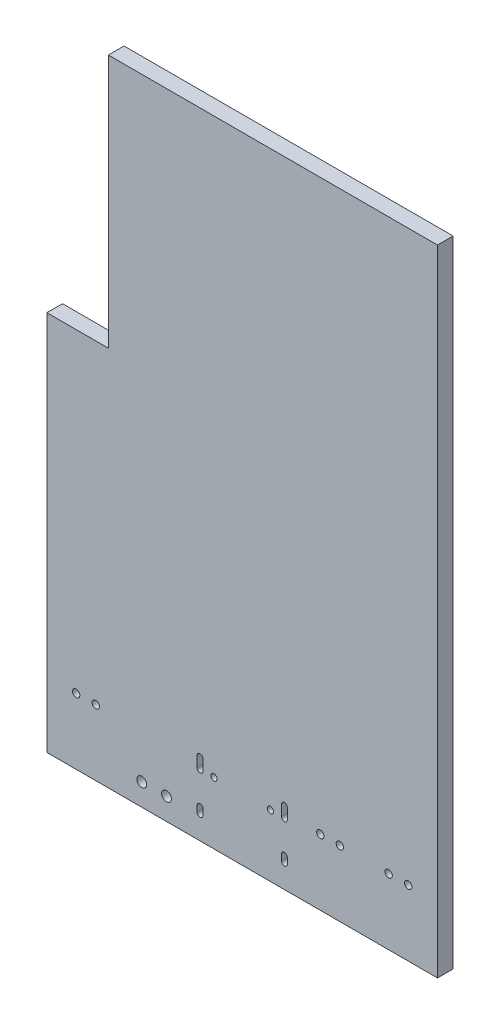
ISO-10303-21;
HEADER;
FILE_DESCRIPTION(('STEP AP214'),'2;1');
FILE_NAME('part.step','',(''),(''),'','','');
FILE_SCHEMA(('AUTOMOTIVE_DESIGN { 1 0 10303 214 1 1 1 1 }'));
ENDSEC;
DATA;
#1=APPLICATION_CONTEXT('core data for automotive mechanical design processes');
#2=APPLICATION_PROTOCOL_DEFINITION('international standard','automotive_design',2000,#1);
#3=PRODUCT_CONTEXT('',#1,'mechanical');
#4=PRODUCT('Part','Part','',(#3));
#5=PRODUCT_RELATED_PRODUCT_CATEGORY('part','',(#4));
#6=PRODUCT_DEFINITION_FORMATION('','',#4);
#7=PRODUCT_DEFINITION_CONTEXT('part definition',#1,'design');
#8=PRODUCT_DEFINITION('design','',#6,#7);
#9=PRODUCT_DEFINITION_SHAPE('','',#8);
#10=(LENGTH_UNIT() NAMED_UNIT(*) SI_UNIT(.MILLI.,.METRE.));
#11=(NAMED_UNIT(*) PLANE_ANGLE_UNIT() SI_UNIT($,.RADIAN.));
#12=(NAMED_UNIT(*) SI_UNIT($,.STERADIAN.) SOLID_ANGLE_UNIT());
#13=UNCERTAINTY_MEASURE_WITH_UNIT(LENGTH_MEASURE(1.E-05),#10,'distance_accuracy_value','');
#14=(GEOMETRIC_REPRESENTATION_CONTEXT(3) GLOBAL_UNCERTAINTY_ASSIGNED_CONTEXT((#13)) GLOBAL_UNIT_ASSIGNED_CONTEXT((#10,
#11,#12)) REPRESENTATION_CONTEXT('',''));
#15=CARTESIAN_POINT('',(0.,0.,0.));
#16=DIRECTION('',(0.,0.,1.));
#17=DIRECTION('',(1.,0.,0.));
#18=AXIS2_PLACEMENT_3D('',#15,#16,#17);
#19=CARTESIAN_POINT('',(133.,-126.25,-0.8));
#20=DIRECTION('',(0.,0.,1.));
#21=DIRECTION('',(1.,0.,0.));
#22=AXIS2_PLACEMENT_3D('',#19,#20,#21);
#23=CYLINDRICAL_SURFACE('',#22,0.375);
#24=DIRECTION('',(0.,0.,1.));
#25=VECTOR('',#24,1.);
#26=CARTESIAN_POINT('',(133.375,-126.25,-0.8));
#27=LINE('',#26,#25);
#28=CARTESIAN_POINT('',(133.375,-126.25,0.));
#29=VERTEX_POINT('',#28);
#30=CARTESIAN_POINT('',(133.375,-126.25,1.6));
#31=VERTEX_POINT('',#30);
#32=EDGE_CURVE('E10',#29,#31,#27,.T.);
#33=ORIENTED_EDGE('',*,*,#32,.F.);
#34=CARTESIAN_POINT('',(133.,-126.25,0.));
#35=DIRECTION('',(0.,0.,1.));
#36=DIRECTION('',(1.,0.,0.));
#37=AXIS2_PLACEMENT_3D('',#34,#35,#36);
#38=CIRCLE('',#37,0.375);
#39=EDGE_CURVE('E334',#29,#29,#38,.T.);
#40=ORIENTED_EDGE('',*,*,#39,.F.);
#41=ORIENTED_EDGE('',*,*,#32,.T.);
#42=CARTESIAN_POINT('',(133.,-126.25,1.6));
#43=DIRECTION('',(0.,0.,1.));
#44=DIRECTION('',(1.,0.,0.));
#45=AXIS2_PLACEMENT_3D('',#42,#43,#44);
#46=CIRCLE('',#45,0.375);
#47=EDGE_CURVE('E417',#31,#31,#46,.T.);
#48=ORIENTED_EDGE('',*,*,#47,.T.);
#49=EDGE_LOOP('',(#33,#40,#41,#48));
#50=FACE_BOUND('',#49,.T.);
#51=ADVANCED_FACE('F16',(#50),#23,.F.);
#52=CARTESIAN_POINT('',(135.,-126.25,-0.8));
#53=DIRECTION('',(0.,0.,1.));
#54=DIRECTION('',(1.,0.,0.));
#55=AXIS2_PLACEMENT_3D('',#52,#53,#54);
#56=CYLINDRICAL_SURFACE('',#55,0.375);
#57=DIRECTION('',(0.,0.,1.));
#58=VECTOR('',#57,1.);
#59=CARTESIAN_POINT('',(135.375,-126.25,-0.8));
#60=LINE('',#59,#58);
#61=CARTESIAN_POINT('',(135.375,-126.25,0.));
#62=VERTEX_POINT('',#61);
#63=CARTESIAN_POINT('',(135.375,-126.25,1.6));
#64=VERTEX_POINT('',#63);
#65=EDGE_CURVE('E27',#62,#64,#60,.T.);
#66=ORIENTED_EDGE('',*,*,#65,.F.);
#67=CARTESIAN_POINT('',(135.,-126.25,0.));
#68=DIRECTION('',(0.,0.,1.));
#69=DIRECTION('',(1.,0.,0.));
#70=AXIS2_PLACEMENT_3D('',#67,#68,#69);
#71=CIRCLE('',#70,0.375);
#72=EDGE_CURVE('E339',#62,#62,#71,.T.);
#73=ORIENTED_EDGE('',*,*,#72,.F.);
#74=ORIENTED_EDGE('',*,*,#65,.T.);
#75=CARTESIAN_POINT('',(135.,-126.25,1.6));
#76=DIRECTION('',(0.,0.,1.));
#77=DIRECTION('',(1.,0.,0.));
#78=AXIS2_PLACEMENT_3D('',#75,#76,#77);
#79=CIRCLE('',#78,0.375);
#80=EDGE_CURVE('E303',#64,#64,#79,.T.);
#81=ORIENTED_EDGE('',*,*,#80,.T.);
#82=EDGE_LOOP('',(#66,#73,#74,#81));
#83=FACE_BOUND('',#82,.T.);
#84=ADVANCED_FACE('F709',(#83),#56,.F.);
#85=CARTESIAN_POINT('',(145.38,-125.57,0.));
#86=DIRECTION('',(1.,0.,0.));
#87=DIRECTION('',(0.,1.,0.));
#88=AXIS2_PLACEMENT_3D('',#85,#86,#87);
#89=PLANE('',#88);
#90=DIRECTION('',(0.,0.,1.));
#91=VECTOR('',#90,1.);
#92=CARTESIAN_POINT('',(145.38,-125.57,0.));
#93=LINE('',#92,#91);
#94=CARTESIAN_POINT('',(145.38,-125.57,0.));
#95=VERTEX_POINT('',#94);
#96=CARTESIAN_POINT('',(145.38,-125.57,1.6));
#97=VERTEX_POINT('',#96);
#98=EDGE_CURVE('E291',#95,#97,#93,.T.);
#99=ORIENTED_EDGE('',*,*,#98,.T.);
#100=DIRECTION('',(0.,-1.,0.));
#101=VECTOR('',#100,1.);
#102=CARTESIAN_POINT('',(145.38,-125.57,1.6));
#103=LINE('',#102,#101);
#104=CARTESIAN_POINT('',(145.38,-126.67,1.6));
#105=VERTEX_POINT('',#104);
#106=EDGE_CURVE('E301',#97,#105,#103,.T.);
#107=ORIENTED_EDGE('',*,*,#106,.T.);
#108=DIRECTION('',(0.,0.,1.));
#109=VECTOR('',#108,1.);
#110=CARTESIAN_POINT('',(145.38,-126.67,0.));
#111=LINE('',#110,#109);
#112=CARTESIAN_POINT('',(145.38,-126.67,0.));
#113=VERTEX_POINT('',#112);
#114=EDGE_CURVE('E394',#113,#105,#111,.T.);
#115=ORIENTED_EDGE('',*,*,#114,.F.);
#116=DIRECTION('',(0.,-1.,0.));
#117=VECTOR('',#116,1.);
#118=CARTESIAN_POINT('',(145.38,-125.57,0.));
#119=LINE('',#118,#117);
#120=EDGE_CURVE('E445',#95,#113,#119,.T.);
#121=ORIENTED_EDGE('',*,*,#120,.F.);
#122=EDGE_LOOP('',(#99,#107,#115,#121));
#123=FACE_BOUND('',#122,.T.);
#124=ADVANCED_FACE('F776',(#123),#89,.T.);
#125=CARTESIAN_POINT('',(145.68,-126.67,0.));
#126=DIRECTION('',(0.,0.,-1.));
#127=DIRECTION('',(1.,0.,0.));
#128=AXIS2_PLACEMENT_3D('',#125,#126,#127);
#129=CYLINDRICAL_SURFACE('',#128,0.3);
#130=ORIENTED_EDGE('',*,*,#114,.T.);
#131=CARTESIAN_POINT('',(145.68,-126.67,1.6));
#132=DIRECTION('',(0.,0.,1.));
#133=DIRECTION('',(1.,0.,0.));
#134=AXIS2_PLACEMENT_3D('',#131,#132,#133);
#135=CIRCLE('',#134,0.3);
#136=CARTESIAN_POINT('',(145.98,-126.67,1.6));
#137=VERTEX_POINT('',#136);
#138=EDGE_CURVE('E309',#105,#137,#135,.T.);
#139=ORIENTED_EDGE('',*,*,#138,.T.);
#140=DIRECTION('',(0.,0.,1.));
#141=VECTOR('',#140,1.);
#142=CARTESIAN_POINT('',(145.98,-126.67,0.));
#143=LINE('',#142,#141);
#144=CARTESIAN_POINT('',(145.98,-126.67,0.));
#145=VERTEX_POINT('',#144);
#146=EDGE_CURVE('E306',#145,#137,#143,.T.);
#147=ORIENTED_EDGE('',*,*,#146,.F.);
#148=CARTESIAN_POINT('',(145.68,-126.67,0.));
#149=DIRECTION('',(0.,0.,1.));
#150=DIRECTION('',(1.,0.,0.));
#151=AXIS2_PLACEMENT_3D('',#148,#149,#150);
#152=CIRCLE('',#151,0.3);
#153=EDGE_CURVE('E526',#113,#145,#152,.T.);
#154=ORIENTED_EDGE('',*,*,#153,.F.);
#155=EDGE_LOOP('',(#130,#139,#147,#154));
#156=FACE_BOUND('',#155,.T.);
#157=ADVANCED_FACE('F772',(#156),#129,.F.);
#158=CARTESIAN_POINT('',(145.98,-126.67,0.));
#159=DIRECTION('',(-1.,0.,0.));
#160=DIRECTION('',(0.,0.,1.));
#161=AXIS2_PLACEMENT_3D('',#158,#159,#160);
#162=PLANE('',#161);
#163=ORIENTED_EDGE('',*,*,#146,.T.);
#164=DIRECTION('',(0.,1.,0.));
#165=VECTOR('',#164,1.);
#166=CARTESIAN_POINT('',(145.98,-126.67,1.6));
#167=LINE('',#166,#165);
#168=CARTESIAN_POINT('',(145.98,-125.57,1.6));
#169=VERTEX_POINT('',#168);
#170=EDGE_CURVE('E299',#137,#169,#167,.T.);
#171=ORIENTED_EDGE('',*,*,#170,.T.);
#172=DIRECTION('',(0.,0.,1.));
#173=VECTOR('',#172,1.);
#174=CARTESIAN_POINT('',(145.98,-125.57,0.));
#175=LINE('',#174,#173);
#176=CARTESIAN_POINT('',(145.98,-125.57,0.));
#177=VERTEX_POINT('',#176);
#178=EDGE_CURVE('E278',#177,#169,#175,.T.);
#179=ORIENTED_EDGE('',*,*,#178,.F.);
#180=DIRECTION('',(0.,1.,0.));
#181=VECTOR('',#180,1.);
#182=CARTESIAN_POINT('',(145.98,-126.67,0.));
#183=LINE('',#182,#181);
#184=EDGE_CURVE('E523',#145,#177,#183,.T.);
#185=ORIENTED_EDGE('',*,*,#184,.F.);
#186=EDGE_LOOP('',(#163,#171,#179,#185));
#187=FACE_BOUND('',#186,.T.);
#188=ADVANCED_FACE('F305',(#187),#162,.T.);
#189=CARTESIAN_POINT('',(145.68,-125.57,0.));
#190=DIRECTION('',(0.,0.,-1.));
#191=DIRECTION('',(1.,0.,0.));
#192=AXIS2_PLACEMENT_3D('',#189,#190,#191);
#193=CYLINDRICAL_SURFACE('',#192,0.3);
#194=ORIENTED_EDGE('',*,*,#178,.T.);
#195=CARTESIAN_POINT('',(145.68,-125.57,1.6));
#196=DIRECTION('',(0.,0.,1.));
#197=DIRECTION('',(1.,0.,0.));
#198=AXIS2_PLACEMENT_3D('',#195,#196,#197);
#199=CIRCLE('',#198,0.3);
#200=EDGE_CURVE('E282',#169,#97,#199,.T.);
#201=ORIENTED_EDGE('',*,*,#200,.T.);
#202=ORIENTED_EDGE('',*,*,#98,.F.);
#203=CARTESIAN_POINT('',(145.68,-125.57,0.));
#204=DIRECTION('',(0.,0.,1.));
#205=DIRECTION('',(1.,0.,0.));
#206=AXIS2_PLACEMENT_3D('',#203,#204,#205);
#207=CIRCLE('',#206,0.3);
#208=EDGE_CURVE('E285',#177,#95,#207,.T.);
#209=ORIENTED_EDGE('',*,*,#208,.F.);
#210=EDGE_LOOP('',(#194,#201,#202,#209));
#211=FACE_BOUND('',#210,.T.);
#212=ADVANCED_FACE('F280',(#211),#193,.F.);
#213=CARTESIAN_POINT('',(147.11,-126.65,-0.8));
#214=DIRECTION('',(0.,0.,1.));
#215=DIRECTION('',(1.,0.,0.));
#216=AXIS2_PLACEMENT_3D('',#213,#214,#215);
#217=CYLINDRICAL_SURFACE('',#216,0.325);
#218=DIRECTION('',(0.,0.,1.));
#219=VECTOR('',#218,1.);
#220=CARTESIAN_POINT('',(147.435,-126.65,-0.8));
#221=LINE('',#220,#219);
#222=CARTESIAN_POINT('',(147.435,-126.65,0.));
#223=VERTEX_POINT('',#222);
#224=CARTESIAN_POINT('',(147.435,-126.65,1.6));
#225=VERTEX_POINT('',#224);
#226=EDGE_CURVE('E292',#223,#225,#221,.T.);
#227=ORIENTED_EDGE('',*,*,#226,.F.);
#228=CARTESIAN_POINT('',(147.11,-126.65,0.));
#229=DIRECTION('',(0.,0.,1.));
#230=DIRECTION('',(1.,0.,0.));
#231=AXIS2_PLACEMENT_3D('',#228,#229,#230);
#232=CIRCLE('',#231,0.325);
#233=EDGE_CURVE('E407',#223,#223,#232,.T.);
#234=ORIENTED_EDGE('',*,*,#233,.F.);
#235=ORIENTED_EDGE('',*,*,#226,.T.);
#236=CARTESIAN_POINT('',(147.11,-126.65,1.6));
#237=DIRECTION('',(0.,0.,1.));
#238=DIRECTION('',(1.,0.,0.));
#239=AXIS2_PLACEMENT_3D('',#236,#237,#238);
#240=CIRCLE('',#239,0.325);
#241=EDGE_CURVE('E310',#225,#225,#240,.T.);
#242=ORIENTED_EDGE('',*,*,#241,.T.);
#243=EDGE_LOOP('',(#227,#234,#235,#242));
#244=FACE_BOUND('',#243,.T.);
#245=ADVANCED_FACE('F767',(#244),#217,.F.);
#246=CARTESIAN_POINT('',(154.02,-125.57,0.));
#247=DIRECTION('',(1.,0.,0.));
#248=DIRECTION('',(0.,1.,0.));
#249=AXIS2_PLACEMENT_3D('',#246,#247,#248);
#250=PLANE('',#249);
#251=DIRECTION('',(0.,0.,1.));
#252=VECTOR('',#251,1.);
#253=CARTESIAN_POINT('',(154.02,-125.57,0.));
#254=LINE('',#253,#252);
#255=CARTESIAN_POINT('',(154.02,-125.57,0.));
#256=VERTEX_POINT('',#255);
#257=CARTESIAN_POINT('',(154.02,-125.57,1.6));
#258=VERTEX_POINT('',#257);
#259=EDGE_CURVE('E20',#256,#258,#254,.T.);
#260=ORIENTED_EDGE('',*,*,#259,.T.);
#261=DIRECTION('',(0.,-1.,0.));
#262=VECTOR('',#261,1.);
#263=CARTESIAN_POINT('',(154.02,-125.57,1.6));
#264=LINE('',#263,#262);
#265=CARTESIAN_POINT('',(154.02,-126.67,1.6));
#266=VERTEX_POINT('',#265);
#267=EDGE_CURVE('E446',#258,#266,#264,.T.);
#268=ORIENTED_EDGE('',*,*,#267,.T.);
#269=DIRECTION('',(0.,0.,1.));
#270=VECTOR('',#269,1.);
#271=CARTESIAN_POINT('',(154.02,-126.67,0.));
#272=LINE('',#271,#270);
#273=CARTESIAN_POINT('',(154.02,-126.67,0.));
#274=VERTEX_POINT('',#273);
#275=EDGE_CURVE('E501',#274,#266,#272,.T.);
#276=ORIENTED_EDGE('',*,*,#275,.F.);
#277=DIRECTION('',(0.,-1.,0.));
#278=VECTOR('',#277,1.);
#279=CARTESIAN_POINT('',(154.02,-125.57,0.));
#280=LINE('',#279,#278);
#281=EDGE_CURVE('E349',#256,#274,#280,.T.);
#282=ORIENTED_EDGE('',*,*,#281,.F.);
#283=EDGE_LOOP('',(#260,#268,#276,#282));
#284=FACE_BOUND('',#283,.T.);
#285=ADVANCED_FACE('F676',(#284),#250,.T.);
#286=CARTESIAN_POINT('',(154.32,-126.67,0.));
#287=DIRECTION('',(0.,0.,-1.));
#288=DIRECTION('',(1.,0.,0.));
#289=AXIS2_PLACEMENT_3D('',#286,#287,#288);
#290=CYLINDRICAL_SURFACE('',#289,0.3);
#291=ORIENTED_EDGE('',*,*,#275,.T.);
#292=CARTESIAN_POINT('',(154.32,-126.67,1.6));
#293=DIRECTION('',(0.,0.,1.));
#294=DIRECTION('',(1.,0.,0.));
#295=AXIS2_PLACEMENT_3D('',#292,#293,#294);
#296=CIRCLE('',#295,0.3);
#297=CARTESIAN_POINT('',(154.62,-126.67,1.6));
#298=VERTEX_POINT('',#297);
#299=EDGE_CURVE('E450',#266,#298,#296,.T.);
#300=ORIENTED_EDGE('',*,*,#299,.T.);
#301=DIRECTION('',(0.,0.,1.));
#302=VECTOR('',#301,1.);
#303=CARTESIAN_POINT('',(154.62,-126.67,0.));
#304=LINE('',#303,#302);
#305=CARTESIAN_POINT('',(154.62,-126.67,0.));
#306=VERTEX_POINT('',#305);
#307=EDGE_CURVE('E503',#306,#298,#304,.T.);
#308=ORIENTED_EDGE('',*,*,#307,.F.);
#309=CARTESIAN_POINT('',(154.32,-126.67,0.));
#310=DIRECTION('',(0.,0.,1.));
#311=DIRECTION('',(1.,0.,0.));
#312=AXIS2_PLACEMENT_3D('',#309,#310,#311);
#313=CIRCLE('',#312,0.3);
#314=EDGE_CURVE('E408',#274,#306,#313,.T.);
#315=ORIENTED_EDGE('',*,*,#314,.F.);
#316=EDGE_LOOP('',(#291,#300,#308,#315));
#317=FACE_BOUND('',#316,.T.);
#318=ADVANCED_FACE('F681',(#317),#290,.F.);
#319=CARTESIAN_POINT('',(154.62,-126.67,0.));
#320=DIRECTION('',(-1.,0.,0.));
#321=DIRECTION('',(0.,0.,1.));
#322=AXIS2_PLACEMENT_3D('',#319,#320,#321);
#323=PLANE('',#322);
#324=ORIENTED_EDGE('',*,*,#307,.T.);
#325=DIRECTION('',(0.,1.,0.));
#326=VECTOR('',#325,1.);
#327=CARTESIAN_POINT('',(154.62,-126.67,1.6));
#328=LINE('',#327,#326);
#329=CARTESIAN_POINT('',(154.62,-125.57,1.6));
#330=VERTEX_POINT('',#329);
#331=EDGE_CURVE('E553',#298,#330,#328,.T.);
#332=ORIENTED_EDGE('',*,*,#331,.T.);
#333=DIRECTION('',(0.,0.,1.));
#334=VECTOR('',#333,1.);
#335=CARTESIAN_POINT('',(154.62,-125.57,0.));
#336=LINE('',#335,#334);
#337=CARTESIAN_POINT('',(154.62,-125.57,0.));
#338=VERTEX_POINT('',#337);
#339=EDGE_CURVE('E325',#338,#330,#336,.T.);
#340=ORIENTED_EDGE('',*,*,#339,.F.);
#341=DIRECTION('',(0.,1.,0.));
#342=VECTOR('',#341,1.);
#343=CARTESIAN_POINT('',(154.62,-126.67,0.));
#344=LINE('',#343,#342);
#345=EDGE_CURVE('E403',#306,#338,#344,.T.);
#346=ORIENTED_EDGE('',*,*,#345,.F.);
#347=EDGE_LOOP('',(#324,#332,#340,#346));
#348=FACE_BOUND('',#347,.T.);
#349=ADVANCED_FACE('F688',(#348),#323,.T.);
#350=CARTESIAN_POINT('',(154.32,-125.57,0.));
#351=DIRECTION('',(0.,0.,-1.));
#352=DIRECTION('',(1.,0.,0.));
#353=AXIS2_PLACEMENT_3D('',#350,#351,#352);
#354=CYLINDRICAL_SURFACE('',#353,0.3);
#355=ORIENTED_EDGE('',*,*,#339,.T.);
#356=CARTESIAN_POINT('',(154.32,-125.57,1.6));
#357=DIRECTION('',(0.,0.,1.));
#358=DIRECTION('',(1.,0.,0.));
#359=AXIS2_PLACEMENT_3D('',#356,#357,#358);
#360=CIRCLE('',#359,0.3);
#361=EDGE_CURVE('E319',#330,#258,#360,.T.);
#362=ORIENTED_EDGE('',*,*,#361,.T.);
#363=ORIENTED_EDGE('',*,*,#259,.F.);
#364=CARTESIAN_POINT('',(154.32,-125.57,0.));
#365=DIRECTION('',(0.,0.,1.));
#366=DIRECTION('',(1.,0.,0.));
#367=AXIS2_PLACEMENT_3D('',#364,#365,#366);
#368=CIRCLE('',#367,0.3);
#369=EDGE_CURVE('E345',#338,#256,#368,.T.);
#370=ORIENTED_EDGE('',*,*,#369,.F.);
#371=EDGE_LOOP('',(#355,#362,#363,#370));
#372=FACE_BOUND('',#371,.T.);
#373=ADVANCED_FACE('F690',(#372),#354,.F.);
#374=CARTESIAN_POINT('',(152.89,-126.65,-0.8));
#375=DIRECTION('',(0.,0.,1.));
#376=DIRECTION('',(1.,0.,0.));
#377=AXIS2_PLACEMENT_3D('',#374,#375,#376);
#378=CYLINDRICAL_SURFACE('',#377,0.325);
#379=DIRECTION('',(0.,0.,1.));
#380=VECTOR('',#379,1.);
#381=CARTESIAN_POINT('',(153.215,-126.65,-0.8));
#382=LINE('',#381,#380);
#383=CARTESIAN_POINT('',(153.215,-126.65,0.));
#384=VERTEX_POINT('',#383);
#385=CARTESIAN_POINT('',(153.215,-126.65,1.6));
#386=VERTEX_POINT('',#385);
#387=EDGE_CURVE('E327',#384,#386,#382,.T.);
#388=ORIENTED_EDGE('',*,*,#387,.F.);
#389=CARTESIAN_POINT('',(152.89,-126.65,0.));
#390=DIRECTION('',(0.,0.,1.));
#391=DIRECTION('',(1.,0.,0.));
#392=AXIS2_PLACEMENT_3D('',#389,#390,#391);
#393=CIRCLE('',#392,0.325);
#394=EDGE_CURVE('E350',#384,#384,#393,.T.);
#395=ORIENTED_EDGE('',*,*,#394,.F.);
#396=ORIENTED_EDGE('',*,*,#387,.T.);
#397=CARTESIAN_POINT('',(152.89,-126.65,1.6));
#398=DIRECTION('',(0.,0.,1.));
#399=DIRECTION('',(1.,0.,0.));
#400=AXIS2_PLACEMENT_3D('',#397,#398,#399);
#401=CIRCLE('',#400,0.325);
#402=EDGE_CURVE('E459',#386,#386,#401,.T.);
#403=ORIENTED_EDGE('',*,*,#402,.T.);
#404=EDGE_LOOP('',(#388,#395,#396,#403));
#405=FACE_BOUND('',#404,.T.);
#406=ADVANCED_FACE('F863',(#405),#378,.F.);
#407=CARTESIAN_POINT('',(158.,-126.25,-0.8));
#408=DIRECTION('',(0.,0.,1.));
#409=DIRECTION('',(1.,0.,0.));
#410=AXIS2_PLACEMENT_3D('',#407,#408,#409);
#411=CYLINDRICAL_SURFACE('',#410,0.375);
#412=DIRECTION('',(0.,0.,1.));
#413=VECTOR('',#412,1.);
#414=CARTESIAN_POINT('',(158.375,-126.25,-0.8));
#415=LINE('',#414,#413);
#416=CARTESIAN_POINT('',(158.375,-126.25,0.));
#417=VERTEX_POINT('',#416);
#418=CARTESIAN_POINT('',(158.375,-126.25,1.6));
#419=VERTEX_POINT('',#418);
#420=EDGE_CURVE('E391',#417,#419,#415,.T.);
#421=ORIENTED_EDGE('',*,*,#420,.F.);
#422=CARTESIAN_POINT('',(158.,-126.25,0.));
#423=DIRECTION('',(0.,0.,1.));
#424=DIRECTION('',(1.,0.,0.));
#425=AXIS2_PLACEMENT_3D('',#422,#423,#424);
#426=CIRCLE('',#425,0.375);
#427=EDGE_CURVE('E354',#417,#417,#426,.T.);
#428=ORIENTED_EDGE('',*,*,#427,.F.);
#429=ORIENTED_EDGE('',*,*,#420,.T.);
#430=CARTESIAN_POINT('',(158.,-126.25,1.6));
#431=DIRECTION('',(0.,0.,1.));
#432=DIRECTION('',(1.,0.,0.));
#433=AXIS2_PLACEMENT_3D('',#430,#431,#432);
#434=CIRCLE('',#433,0.375);
#435=EDGE_CURVE('E455',#419,#419,#434,.T.);
#436=ORIENTED_EDGE('',*,*,#435,.T.);
#437=EDGE_LOOP('',(#421,#428,#429,#436));
#438=FACE_BOUND('',#437,.T.);
#439=ADVANCED_FACE('F741',(#438),#411,.F.);
#440=CARTESIAN_POINT('',(160.,-126.25,-0.8));
#441=DIRECTION('',(0.,0.,1.));
#442=DIRECTION('',(1.,0.,0.));
#443=AXIS2_PLACEMENT_3D('',#440,#441,#442);
#444=CYLINDRICAL_SURFACE('',#443,0.375);
#445=DIRECTION('',(0.,0.,1.));
#446=VECTOR('',#445,1.);
#447=CARTESIAN_POINT('',(160.375,-126.25,-0.8));
#448=LINE('',#447,#446);
#449=CARTESIAN_POINT('',(160.375,-126.25,0.));
#450=VERTEX_POINT('',#449);
#451=CARTESIAN_POINT('',(160.375,-126.25,1.6));
#452=VERTEX_POINT('',#451);
#453=EDGE_CURVE('E532',#450,#452,#448,.T.);
#454=ORIENTED_EDGE('',*,*,#453,.F.);
#455=CARTESIAN_POINT('',(160.,-126.25,0.));
#456=DIRECTION('',(0.,0.,1.));
#457=DIRECTION('',(1.,0.,0.));
#458=AXIS2_PLACEMENT_3D('',#455,#456,#457);
#459=CIRCLE('',#458,0.375);
#460=EDGE_CURVE('E522',#450,#450,#459,.T.);
#461=ORIENTED_EDGE('',*,*,#460,.F.);
#462=ORIENTED_EDGE('',*,*,#453,.T.);
#463=CARTESIAN_POINT('',(160.,-126.25,1.6));
#464=DIRECTION('',(0.,0.,1.));
#465=DIRECTION('',(1.,0.,0.));
#466=AXIS2_PLACEMENT_3D('',#463,#464,#465);
#467=CIRCLE('',#466,0.375);
#468=EDGE_CURVE('E386',#452,#452,#467,.T.);
#469=ORIENTED_EDGE('',*,*,#468,.T.);
#470=EDGE_LOOP('',(#454,#461,#462,#469));
#471=FACE_BOUND('',#470,.T.);
#472=ADVANCED_FACE('F736',(#471),#444,.F.);
#473=CARTESIAN_POINT('',(165.,-126.25,-0.8));
#474=DIRECTION('',(0.,0.,1.));
#475=DIRECTION('',(1.,0.,0.));
#476=AXIS2_PLACEMENT_3D('',#473,#474,#475);
#477=CYLINDRICAL_SURFACE('',#476,0.375);
#478=DIRECTION('',(0.,0.,1.));
#479=VECTOR('',#478,1.);
#480=CARTESIAN_POINT('',(165.375,-126.25,-0.8));
#481=LINE('',#480,#479);
#482=CARTESIAN_POINT('',(165.375,-126.25,0.));
#483=VERTEX_POINT('',#482);
#484=CARTESIAN_POINT('',(165.375,-126.25,1.6));
#485=VERTEX_POINT('',#484);
#486=EDGE_CURVE('E530',#483,#485,#481,.T.);
#487=ORIENTED_EDGE('',*,*,#486,.F.);
#488=CARTESIAN_POINT('',(165.,-126.25,0.));
#489=DIRECTION('',(0.,0.,1.));
#490=DIRECTION('',(1.,0.,0.));
#491=AXIS2_PLACEMENT_3D('',#488,#489,#490);
#492=CIRCLE('',#491,0.375);
#493=EDGE_CURVE('E323',#483,#483,#492,.T.);
#494=ORIENTED_EDGE('',*,*,#493,.F.);
#495=ORIENTED_EDGE('',*,*,#486,.T.);
#496=CARTESIAN_POINT('',(165.,-126.25,1.6));
#497=DIRECTION('',(0.,0.,1.));
#498=DIRECTION('',(1.,0.,0.));
#499=AXIS2_PLACEMENT_3D('',#496,#497,#498);
#500=CIRCLE('',#499,0.375);
#501=EDGE_CURVE('E382',#485,#485,#500,.T.);
#502=ORIENTED_EDGE('',*,*,#501,.T.);
#503=EDGE_LOOP('',(#487,#494,#495,#502));
#504=FACE_BOUND('',#503,.T.);
#505=ADVANCED_FACE('F740',(#504),#477,.F.);
#506=CARTESIAN_POINT('',(167.,-126.25,-0.8));
#507=DIRECTION('',(0.,0.,1.));
#508=DIRECTION('',(1.,0.,0.));
#509=AXIS2_PLACEMENT_3D('',#506,#507,#508);
#510=CYLINDRICAL_SURFACE('',#509,0.375);
#511=DIRECTION('',(0.,0.,1.));
#512=VECTOR('',#511,1.);
#513=CARTESIAN_POINT('',(167.375,-126.25,-0.8));
#514=LINE('',#513,#512);
#515=CARTESIAN_POINT('',(167.375,-126.25,0.));
#516=VERTEX_POINT('',#515);
#517=CARTESIAN_POINT('',(167.375,-126.25,1.6));
#518=VERTEX_POINT('',#517);
#519=EDGE_CURVE('E533',#516,#518,#514,.T.);
#520=ORIENTED_EDGE('',*,*,#519,.F.);
#521=CARTESIAN_POINT('',(167.,-126.25,0.));
#522=DIRECTION('',(0.,0.,1.));
#523=DIRECTION('',(1.,0.,0.));
#524=AXIS2_PLACEMENT_3D('',#521,#522,#523);
#525=CIRCLE('',#524,0.375);
#526=EDGE_CURVE('E529',#516,#516,#525,.T.);
#527=ORIENTED_EDGE('',*,*,#526,.F.);
#528=ORIENTED_EDGE('',*,*,#519,.T.);
#529=CARTESIAN_POINT('',(167.,-126.25,1.6));
#530=DIRECTION('',(0.,0.,1.));
#531=DIRECTION('',(1.,0.,0.));
#532=AXIS2_PLACEMENT_3D('',#529,#530,#531);
#533=CIRCLE('',#532,0.375);
#534=EDGE_CURVE('E387',#518,#518,#533,.T.);
#535=ORIENTED_EDGE('',*,*,#534,.T.);
#536=EDGE_LOOP('',(#520,#527,#528,#535));
#537=FACE_BOUND('',#536,.T.);
#538=ADVANCED_FACE('F569',(#537),#510,.F.);
#539=CARTESIAN_POINT('',(139.71,-130.75,-0.8));
#540=DIRECTION('',(0.,0.,1.));
#541=DIRECTION('',(1.,0.,0.));
#542=AXIS2_PLACEMENT_3D('',#539,#540,#541);
#543=CYLINDRICAL_SURFACE('',#542,0.5);
#544=DIRECTION('',(0.,0.,1.));
#545=VECTOR('',#544,1.);
#546=CARTESIAN_POINT('',(140.21,-130.75,-0.8));
#547=LINE('',#546,#545);
#548=CARTESIAN_POINT('',(140.21,-130.75,0.));
#549=VERTEX_POINT('',#548);
#550=CARTESIAN_POINT('',(140.21,-130.75,1.6));
#551=VERTEX_POINT('',#550);
#552=EDGE_CURVE('E363',#549,#551,#547,.T.);
#553=ORIENTED_EDGE('',*,*,#552,.F.);
#554=CARTESIAN_POINT('',(139.71,-130.75,0.));
#555=DIRECTION('',(0.,0.,1.));
#556=DIRECTION('',(1.,0.,0.));
#557=AXIS2_PLACEMENT_3D('',#554,#555,#556);
#558=CIRCLE('',#557,0.5);
#559=EDGE_CURVE('E474',#549,#549,#558,.T.);
#560=ORIENTED_EDGE('',*,*,#559,.F.);
#561=ORIENTED_EDGE('',*,*,#552,.T.);
#562=CARTESIAN_POINT('',(139.71,-130.75,1.6));
#563=DIRECTION('',(0.,0.,1.));
#564=DIRECTION('',(1.,0.,0.));
#565=AXIS2_PLACEMENT_3D('',#562,#563,#564);
#566=CIRCLE('',#565,0.5);
#567=EDGE_CURVE('E506',#551,#551,#566,.T.);
#568=ORIENTED_EDGE('',*,*,#567,.T.);
#569=EDGE_LOOP('',(#553,#560,#561,#568));
#570=FACE_BOUND('',#569,.T.);
#571=ADVANCED_FACE('F799',(#570),#543,.F.);
#572=CARTESIAN_POINT('',(145.38,-130.,0.));
#573=DIRECTION('',(1.,0.,0.));
#574=DIRECTION('',(0.,1.,0.));
#575=AXIS2_PLACEMENT_3D('',#572,#573,#574);
#576=PLANE('',#575);
#577=DIRECTION('',(0.,0.,1.));
#578=VECTOR('',#577,1.);
#579=CARTESIAN_POINT('',(145.38,-130.,0.));
#580=LINE('',#579,#578);
#581=CARTESIAN_POINT('',(145.38,-130.,0.));
#582=VERTEX_POINT('',#581);
#583=CARTESIAN_POINT('',(145.38,-130.,1.6));
#584=VERTEX_POINT('',#583);
#585=EDGE_CURVE('E381',#582,#584,#580,.T.);
#586=ORIENTED_EDGE('',*,*,#585,.T.);
#587=DIRECTION('',(0.,-1.,0.));
#588=VECTOR('',#587,1.);
#589=CARTESIAN_POINT('',(145.38,-130.,1.6));
#590=LINE('',#589,#588);
#591=CARTESIAN_POINT('',(145.38,-130.6,1.6));
#592=VERTEX_POINT('',#591);
#593=EDGE_CURVE('E340',#584,#592,#590,.T.);
#594=ORIENTED_EDGE('',*,*,#593,.T.);
#595=DIRECTION('',(0.,0.,1.));
#596=VECTOR('',#595,1.);
#597=CARTESIAN_POINT('',(145.38,-130.6,0.));
#598=LINE('',#597,#596);
#599=CARTESIAN_POINT('',(145.38,-130.6,0.));
#600=VERTEX_POINT('',#599);
#601=EDGE_CURVE('E122',#600,#592,#598,.T.);
#602=ORIENTED_EDGE('',*,*,#601,.F.);
#603=DIRECTION('',(0.,-1.,0.));
#604=VECTOR('',#603,1.);
#605=CARTESIAN_POINT('',(145.38,-130.,0.));
#606=LINE('',#605,#604);
#607=EDGE_CURVE('E359',#582,#600,#606,.T.);
#608=ORIENTED_EDGE('',*,*,#607,.F.);
#609=EDGE_LOOP('',(#586,#594,#602,#608));
#610=FACE_BOUND('',#609,.T.);
#611=ADVANCED_FACE('F803',(#610),#576,.T.);
#612=CARTESIAN_POINT('',(145.68,-130.6,0.));
#613=DIRECTION('',(0.,0.,-1.));
#614=DIRECTION('',(1.,0.,0.));
#615=AXIS2_PLACEMENT_3D('',#612,#613,#614);
#616=CYLINDRICAL_SURFACE('',#615,0.3);
#617=ORIENTED_EDGE('',*,*,#601,.T.);
#618=CARTESIAN_POINT('',(145.68,-130.6,1.6));
#619=DIRECTION('',(0.,0.,1.));
#620=DIRECTION('',(1.,0.,0.));
#621=AXIS2_PLACEMENT_3D('',#618,#619,#620);
#622=CIRCLE('',#621,0.3);
#623=CARTESIAN_POINT('',(145.98,-130.6,1.6));
#624=VERTEX_POINT('',#623);
#625=EDGE_CURVE('E344',#592,#624,#622,.T.);
#626=ORIENTED_EDGE('',*,*,#625,.T.);
#627=DIRECTION('',(0.,0.,1.));
#628=VECTOR('',#627,1.);
#629=CARTESIAN_POINT('',(145.98,-130.6,0.));
#630=LINE('',#629,#628);
#631=CARTESIAN_POINT('',(145.98,-130.6,0.));
#632=VERTEX_POINT('',#631);
#633=EDGE_CURVE('E106',#632,#624,#630,.T.);
#634=ORIENTED_EDGE('',*,*,#633,.F.);
#635=CARTESIAN_POINT('',(145.68,-130.6,0.));
#636=DIRECTION('',(0.,0.,1.));
#637=DIRECTION('',(1.,0.,0.));
#638=AXIS2_PLACEMENT_3D('',#635,#636,#637);
#639=CIRCLE('',#638,0.3);
#640=EDGE_CURVE('E426',#600,#632,#639,.T.);
#641=ORIENTED_EDGE('',*,*,#640,.F.);
#642=EDGE_LOOP('',(#617,#626,#634,#641));
#643=FACE_BOUND('',#642,.T.);
#644=ADVANCED_FACE('F785',(#643),#616,.F.);
#645=CARTESIAN_POINT('',(145.98,-130.6,0.));
#646=DIRECTION('',(-1.,0.,0.));
#647=DIRECTION('',(0.,0.,1.));
#648=AXIS2_PLACEMENT_3D('',#645,#646,#647);
#649=PLANE('',#648);
#650=ORIENTED_EDGE('',*,*,#633,.T.);
#651=DIRECTION('',(0.,1.,0.));
#652=VECTOR('',#651,1.);
#653=CARTESIAN_POINT('',(145.98,-130.6,1.6));
#654=LINE('',#653,#652);
#655=CARTESIAN_POINT('',(145.98,-130.,1.6));
#656=VERTEX_POINT('',#655);
#657=EDGE_CURVE('E378',#624,#656,#654,.T.);
#658=ORIENTED_EDGE('',*,*,#657,.T.);
#659=DIRECTION('',(0.,0.,1.));
#660=VECTOR('',#659,1.);
#661=CARTESIAN_POINT('',(145.98,-130.,0.));
#662=LINE('',#661,#660);
#663=CARTESIAN_POINT('',(145.98,-130.,0.));
#664=VERTEX_POINT('',#663);
#665=EDGE_CURVE('E368',#664,#656,#662,.T.);
#666=ORIENTED_EDGE('',*,*,#665,.F.);
#667=DIRECTION('',(0.,1.,0.));
#668=VECTOR('',#667,1.);
#669=CARTESIAN_POINT('',(145.98,-130.6,0.));
#670=LINE('',#669,#668);
#671=EDGE_CURVE('E430',#632,#664,#670,.T.);
#672=ORIENTED_EDGE('',*,*,#671,.F.);
#673=EDGE_LOOP('',(#650,#658,#666,#672));
#674=FACE_BOUND('',#673,.T.);
#675=ADVANCED_FACE('F758',(#674),#649,.T.);
#676=CARTESIAN_POINT('',(145.68,-130.,0.));
#677=DIRECTION('',(0.,0.,-1.));
#678=DIRECTION('',(1.,0.,0.));
#679=AXIS2_PLACEMENT_3D('',#676,#677,#678);
#680=CYLINDRICAL_SURFACE('',#679,0.3);
#681=ORIENTED_EDGE('',*,*,#665,.T.);
#682=CARTESIAN_POINT('',(145.68,-130.,1.6));
#683=DIRECTION('',(0.,0.,1.));
#684=DIRECTION('',(1.,0.,0.));
#685=AXIS2_PLACEMENT_3D('',#682,#683,#684);
#686=CIRCLE('',#685,0.3);
#687=EDGE_CURVE('E343',#656,#584,#686,.T.);
#688=ORIENTED_EDGE('',*,*,#687,.T.);
#689=ORIENTED_EDGE('',*,*,#585,.F.);
#690=CARTESIAN_POINT('',(145.68,-130.,0.));
#691=DIRECTION('',(0.,0.,1.));
#692=DIRECTION('',(1.,0.,0.));
#693=AXIS2_PLACEMENT_3D('',#690,#691,#692);
#694=CIRCLE('',#693,0.3);
#695=EDGE_CURVE('E355',#664,#582,#694,.T.);
#696=ORIENTED_EDGE('',*,*,#695,.F.);
#697=EDGE_LOOP('',(#681,#688,#689,#696));
#698=FACE_BOUND('',#697,.T.);
#699=ADVANCED_FACE('F754',(#698),#680,.F.);
#700=CARTESIAN_POINT('',(142.25,-130.75,-0.8));
#701=DIRECTION('',(0.,0.,1.));
#702=DIRECTION('',(1.,0.,0.));
#703=AXIS2_PLACEMENT_3D('',#700,#701,#702);
#704=CYLINDRICAL_SURFACE('',#703,0.5);
#705=DIRECTION('',(0.,0.,1.));
#706=VECTOR('',#705,1.);
#707=CARTESIAN_POINT('',(142.75,-130.75,-0.8));
#708=LINE('',#707,#706);
#709=CARTESIAN_POINT('',(142.75,-130.75,0.));
#710=VERTEX_POINT('',#709);
#711=CARTESIAN_POINT('',(142.75,-130.75,1.6));
#712=VERTEX_POINT('',#711);
#713=EDGE_CURVE('E364',#710,#712,#708,.T.);
#714=ORIENTED_EDGE('',*,*,#713,.F.);
#715=CARTESIAN_POINT('',(142.25,-130.75,0.));
#716=DIRECTION('',(0.,0.,1.));
#717=DIRECTION('',(1.,0.,0.));
#718=AXIS2_PLACEMENT_3D('',#715,#716,#717);
#719=CIRCLE('',#718,0.5);
#720=EDGE_CURVE('E360',#710,#710,#719,.T.);
#721=ORIENTED_EDGE('',*,*,#720,.F.);
#722=ORIENTED_EDGE('',*,*,#713,.T.);
#723=CARTESIAN_POINT('',(142.25,-130.75,1.6));
#724=DIRECTION('',(0.,0.,1.));
#725=DIRECTION('',(1.,0.,0.));
#726=AXIS2_PLACEMENT_3D('',#723,#724,#725);
#727=CIRCLE('',#726,0.5);
#728=EDGE_CURVE('E431',#712,#712,#727,.T.);
#729=ORIENTED_EDGE('',*,*,#728,.T.);
#730=EDGE_LOOP('',(#714,#721,#722,#729));
#731=FACE_BOUND('',#730,.T.);
#732=ADVANCED_FACE('F18',(#731),#704,.F.);
#733=CARTESIAN_POINT('',(154.02,-130.,0.));
#734=DIRECTION('',(1.,0.,0.));
#735=DIRECTION('',(0.,1.,0.));
#736=AXIS2_PLACEMENT_3D('',#733,#734,#735);
#737=PLANE('',#736);
#738=DIRECTION('',(0.,0.,1.));
#739=VECTOR('',#738,1.);
#740=CARTESIAN_POINT('',(154.02,-130.,0.));
#741=LINE('',#740,#739);
#742=CARTESIAN_POINT('',(154.02,-130.,0.));
#743=VERTEX_POINT('',#742);
#744=CARTESIAN_POINT('',(154.02,-130.,1.6));
#745=VERTEX_POINT('',#744);
#746=EDGE_CURVE('E475',#743,#745,#741,.T.);
#747=ORIENTED_EDGE('',*,*,#746,.T.);
#748=DIRECTION('',(0.,-1.,0.));
#749=VECTOR('',#748,1.);
#750=CARTESIAN_POINT('',(154.02,-130.,1.6));
#751=LINE('',#750,#749);
#752=CARTESIAN_POINT('',(154.02,-130.6,1.6));
#753=VERTEX_POINT('',#752);
#754=EDGE_CURVE('E418',#745,#753,#751,.T.);
#755=ORIENTED_EDGE('',*,*,#754,.T.);
#756=DIRECTION('',(0.,0.,1.));
#757=VECTOR('',#756,1.);
#758=CARTESIAN_POINT('',(154.02,-130.6,0.));
#759=LINE('',#758,#757);
#760=CARTESIAN_POINT('',(154.02,-130.6,0.));
#761=VERTEX_POINT('',#760);
#762=EDGE_CURVE('E369',#761,#753,#759,.T.);
#763=ORIENTED_EDGE('',*,*,#762,.F.);
#764=DIRECTION('',(0.,-1.,0.));
#765=VECTOR('',#764,1.);
#766=CARTESIAN_POINT('',(154.02,-130.,0.));
#767=LINE('',#766,#765);
#768=EDGE_CURVE('E375',#743,#761,#767,.T.);
#769=ORIENTED_EDGE('',*,*,#768,.F.);
#770=EDGE_LOOP('',(#747,#755,#763,#769));
#771=FACE_BOUND('',#770,.T.);
#772=ADVANCED_FACE('F651',(#771),#737,.T.);
#773=CARTESIAN_POINT('',(154.32,-130.6,0.));
#774=DIRECTION('',(0.,0.,-1.));
#775=DIRECTION('',(1.,0.,0.));
#776=AXIS2_PLACEMENT_3D('',#773,#774,#775);
#777=CYLINDRICAL_SURFACE('',#776,0.3);
#778=ORIENTED_EDGE('',*,*,#762,.T.);
#779=CARTESIAN_POINT('',(154.32,-130.6,1.6));
#780=DIRECTION('',(0.,0.,1.));
#781=DIRECTION('',(1.,0.,0.));
#782=AXIS2_PLACEMENT_3D('',#779,#780,#781);
#783=CIRCLE('',#782,0.3);
#784=CARTESIAN_POINT('',(154.62,-130.6,1.6));
#785=VERTEX_POINT('',#784);
#786=EDGE_CURVE('E332',#753,#785,#783,.T.);
#787=ORIENTED_EDGE('',*,*,#786,.T.);
#788=DIRECTION('',(0.,0.,1.));
#789=VECTOR('',#788,1.);
#790=CARTESIAN_POINT('',(154.62,-130.6,0.));
#791=LINE('',#790,#789);
#792=CARTESIAN_POINT('',(154.62,-130.6,0.));
#793=VERTEX_POINT('',#792);
#794=EDGE_CURVE('E478',#793,#785,#791,.T.);
#795=ORIENTED_EDGE('',*,*,#794,.F.);
#796=CARTESIAN_POINT('',(154.32,-130.6,0.));
#797=DIRECTION('',(0.,0.,1.));
#798=DIRECTION('',(1.,0.,0.));
#799=AXIS2_PLACEMENT_3D('',#796,#797,#798);
#800=CIRCLE('',#799,0.3);
#801=EDGE_CURVE('E370',#761,#793,#800,.T.);
#802=ORIENTED_EDGE('',*,*,#801,.F.);
#803=EDGE_LOOP('',(#778,#787,#795,#802));
#804=FACE_BOUND('',#803,.T.);
#805=ADVANCED_FACE('F656',(#804),#777,.F.);
#806=CARTESIAN_POINT('',(154.62,-130.6,0.));
#807=DIRECTION('',(-1.,0.,0.));
#808=DIRECTION('',(0.,0.,1.));
#809=AXIS2_PLACEMENT_3D('',#806,#807,#808);
#810=PLANE('',#809);
#811=ORIENTED_EDGE('',*,*,#794,.T.);
#812=DIRECTION('',(0.,1.,0.));
#813=VECTOR('',#812,1.);
#814=CARTESIAN_POINT('',(154.62,-130.6,1.6));
#815=LINE('',#814,#813);
#816=CARTESIAN_POINT('',(154.62,-130.,1.6));
#817=VERTEX_POINT('',#816);
#818=EDGE_CURVE('E328',#785,#817,#815,.T.);
#819=ORIENTED_EDGE('',*,*,#818,.T.);
#820=DIRECTION('',(0.,0.,1.));
#821=VECTOR('',#820,1.);
#822=CARTESIAN_POINT('',(154.62,-130.,0.));
#823=LINE('',#822,#821);
#824=CARTESIAN_POINT('',(154.62,-130.,0.));
#825=VERTEX_POINT('',#824);
#826=EDGE_CURVE('E479',#825,#817,#823,.T.);
#827=ORIENTED_EDGE('',*,*,#826,.F.);
#828=DIRECTION('',(0.,1.,0.));
#829=VECTOR('',#828,1.);
#830=CARTESIAN_POINT('',(154.62,-130.6,0.));
#831=LINE('',#830,#829);
#832=EDGE_CURVE('E374',#793,#825,#831,.T.);
#833=ORIENTED_EDGE('',*,*,#832,.F.);
#834=EDGE_LOOP('',(#811,#819,#827,#833));
#835=FACE_BOUND('',#834,.T.);
#836=ADVANCED_FACE('F724',(#835),#810,.T.);
#837=CARTESIAN_POINT('',(154.32,-130.,0.));
#838=DIRECTION('',(0.,0.,-1.));
#839=DIRECTION('',(1.,0.,0.));
#840=AXIS2_PLACEMENT_3D('',#837,#838,#839);
#841=CYLINDRICAL_SURFACE('',#840,0.3);
#842=ORIENTED_EDGE('',*,*,#826,.T.);
#843=CARTESIAN_POINT('',(154.32,-130.,1.6));
#844=DIRECTION('',(0.,0.,1.));
#845=DIRECTION('',(1.,0.,0.));
#846=AXIS2_PLACEMENT_3D('',#843,#844,#845);
#847=CIRCLE('',#846,0.3);
#848=EDGE_CURVE('E422',#817,#745,#847,.T.);
#849=ORIENTED_EDGE('',*,*,#848,.T.);
#850=ORIENTED_EDGE('',*,*,#746,.F.);
#851=CARTESIAN_POINT('',(154.32,-130.,0.));
#852=DIRECTION('',(0.,0.,1.));
#853=DIRECTION('',(1.,0.,0.));
#854=AXIS2_PLACEMENT_3D('',#851,#852,#853);
#855=CIRCLE('',#854,0.3);
#856=EDGE_CURVE('E409',#825,#743,#855,.T.);
#857=ORIENTED_EDGE('',*,*,#856,.F.);
#858=EDGE_LOOP('',(#842,#849,#850,#857));
#859=FACE_BOUND('',#858,.T.);
#860=ADVANCED_FACE('F647',(#859),#841,.F.);
#861=CARTESIAN_POINT('',(170.,-133.,0.));
#862=DIRECTION('',(0.,-1.,0.));
#863=DIRECTION('',(0.,0.,-1.));
#864=AXIS2_PLACEMENT_3D('',#861,#862,#863);
#865=PLANE('',#864);
#866=DIRECTION('',(0.,0.,1.));
#867=VECTOR('',#866,1.);
#868=CARTESIAN_POINT('',(170.,-133.,0.));
#869=LINE('',#868,#867);
#870=CARTESIAN_POINT('',(170.,-133.,0.));
#871=VERTEX_POINT('',#870);
#872=CARTESIAN_POINT('',(170.,-133.,1.6));
#873=VERTEX_POINT('',#872);
#874=EDGE_CURVE('E488',#871,#873,#869,.T.);
#875=ORIENTED_EDGE('',*,*,#874,.T.);
#876=DIRECTION('',(-1.,0.,0.));
#877=VECTOR('',#876,1.);
#878=CARTESIAN_POINT('',(170.,-133.,1.6));
#879=LINE('',#878,#877);
#880=CARTESIAN_POINT('',(130.,-133.,1.6));
#881=VERTEX_POINT('',#880);
#882=EDGE_CURVE('E451',#873,#881,#879,.T.);
#883=ORIENTED_EDGE('',*,*,#882,.T.);
#884=DIRECTION('',(0.,0.,1.));
#885=VECTOR('',#884,1.);
#886=CARTESIAN_POINT('',(130.,-133.,0.));
#887=LINE('',#886,#885);
#888=CARTESIAN_POINT('',(130.,-133.,0.));
#889=VERTEX_POINT('',#888);
#890=EDGE_CURVE('E471',#889,#881,#887,.T.);
#891=ORIENTED_EDGE('',*,*,#890,.F.);
#892=DIRECTION('',(-1.,0.,0.));
#893=VECTOR('',#892,1.);
#894=CARTESIAN_POINT('',(170.,-133.,0.));
#895=LINE('',#894,#893);
#896=EDGE_CURVE('E513',#871,#889,#895,.T.);
#897=ORIENTED_EDGE('',*,*,#896,.F.);
#898=EDGE_LOOP('',(#875,#883,#891,#897));
#899=FACE_BOUND('',#898,.T.);
#900=ADVANCED_FACE('F608',(#899),#865,.T.);
#901=CARTESIAN_POINT('',(170.,-68.,0.));
#902=DIRECTION('',(1.,0.,0.));
#903=DIRECTION('',(0.,1.,0.));
#904=AXIS2_PLACEMENT_3D('',#901,#902,#903);
#905=PLANE('',#904);
#906=DIRECTION('',(0.,0.,1.));
#907=VECTOR('',#906,1.);
#908=CARTESIAN_POINT('',(170.,-68.,0.));
#909=LINE('',#908,#907);
#910=CARTESIAN_POINT('',(170.,-68.,0.));
#911=VERTEX_POINT('',#910);
#912=CARTESIAN_POINT('',(170.,-68.,1.6));
#913=VERTEX_POINT('',#912);
#914=EDGE_CURVE('E399',#911,#913,#909,.T.);
#915=ORIENTED_EDGE('',*,*,#914,.T.);
#916=DIRECTION('',(0.,-1.,0.));
#917=VECTOR('',#916,1.);
#918=CARTESIAN_POINT('',(170.,-68.,1.6));
#919=LINE('',#918,#917);
#920=EDGE_CURVE('E333',#913,#873,#919,.T.);
#921=ORIENTED_EDGE('',*,*,#920,.T.);
#922=ORIENTED_EDGE('',*,*,#874,.F.);
#923=DIRECTION('',(0.,-1.,0.));
#924=VECTOR('',#923,1.);
#925=CARTESIAN_POINT('',(170.,-68.,0.));
#926=LINE('',#925,#924);
#927=EDGE_CURVE('E439',#911,#871,#926,.T.);
#928=ORIENTED_EDGE('',*,*,#927,.F.);
#929=EDGE_LOOP('',(#915,#921,#922,#928));
#930=FACE_BOUND('',#929,.T.);
#931=ADVANCED_FACE('F619',(#930),#905,.T.);
#932=CARTESIAN_POINT('',(130.,-133.,0.));
#933=DIRECTION('',(-1.,0.,0.));
#934=DIRECTION('',(0.,0.,1.));
#935=AXIS2_PLACEMENT_3D('',#932,#933,#934);
#936=PLANE('',#935);
#937=ORIENTED_EDGE('',*,*,#890,.T.);
#938=DIRECTION('',(0.,1.,0.));
#939=VECTOR('',#938,1.);
#940=CARTESIAN_POINT('',(130.,-133.,1.6));
#941=LINE('',#940,#939);
#942=CARTESIAN_POINT('',(130.,-94.,1.6));
#943=VERTEX_POINT('',#942);
#944=EDGE_CURVE('E338',#881,#943,#941,.T.);
#945=ORIENTED_EDGE('',*,*,#944,.T.);
#946=DIRECTION('',(0.,0.,1.));
#947=VECTOR('',#946,1.);
#948=CARTESIAN_POINT('',(130.,-94.,0.));
#949=LINE('',#948,#947);
#950=CARTESIAN_POINT('',(130.,-94.,0.));
#951=VERTEX_POINT('',#950);
#952=EDGE_CURVE('E562',#951,#943,#949,.T.);
#953=ORIENTED_EDGE('',*,*,#952,.F.);
#954=DIRECTION('',(0.,1.,0.));
#955=VECTOR('',#954,1.);
#956=CARTESIAN_POINT('',(130.,-133.,0.));
#957=LINE('',#956,#955);
#958=EDGE_CURVE('E413',#889,#951,#957,.T.);
#959=ORIENTED_EDGE('',*,*,#958,.F.);
#960=EDGE_LOOP('',(#937,#945,#953,#959));
#961=FACE_BOUND('',#960,.T.);
#962=ADVANCED_FACE('F575',(#961),#936,.T.);
#963=CARTESIAN_POINT('',(150.78,-101.28,1.6));
#964=DIRECTION('',(0.,0.,-1.));
#965=DIRECTION('',(0.,-1.,0.));
#966=AXIS2_PLACEMENT_3D('',#963,#964,#965);
#967=PLANE('',#966);
#968=ORIENTED_EDGE('',*,*,#47,.F.);
#969=EDGE_LOOP('',(#968));
#970=FACE_BOUND('',#969,.T.);
#971=ORIENTED_EDGE('',*,*,#80,.F.);
#972=EDGE_LOOP('',(#971));
#973=FACE_BOUND('',#972,.T.);
#974=ORIENTED_EDGE('',*,*,#170,.F.);
#975=ORIENTED_EDGE('',*,*,#138,.F.);
#976=ORIENTED_EDGE('',*,*,#106,.F.);
#977=ORIENTED_EDGE('',*,*,#200,.F.);
#978=EDGE_LOOP('',(#974,#975,#976,#977));
#979=FACE_BOUND('',#978,.T.);
#980=ORIENTED_EDGE('',*,*,#241,.F.);
#981=EDGE_LOOP('',(#980));
#982=FACE_BOUND('',#981,.T.);
#983=ORIENTED_EDGE('',*,*,#331,.F.);
#984=ORIENTED_EDGE('',*,*,#299,.F.);
#985=ORIENTED_EDGE('',*,*,#267,.F.);
#986=ORIENTED_EDGE('',*,*,#361,.F.);
#987=EDGE_LOOP('',(#983,#984,#985,#986));
#988=FACE_BOUND('',#987,.T.);
#989=ORIENTED_EDGE('',*,*,#402,.F.);
#990=EDGE_LOOP('',(#989));
#991=FACE_BOUND('',#990,.T.);
#992=ORIENTED_EDGE('',*,*,#435,.F.);
#993=EDGE_LOOP('',(#992));
#994=FACE_BOUND('',#993,.T.);
#995=ORIENTED_EDGE('',*,*,#468,.F.);
#996=EDGE_LOOP('',(#995));
#997=FACE_BOUND('',#996,.T.);
#998=ORIENTED_EDGE('',*,*,#501,.F.);
#999=EDGE_LOOP('',(#998));
#1000=FACE_BOUND('',#999,.T.);
#1001=ORIENTED_EDGE('',*,*,#534,.F.);
#1002=EDGE_LOOP('',(#1001));
#1003=FACE_BOUND('',#1002,.T.);
#1004=ORIENTED_EDGE('',*,*,#567,.F.);
#1005=EDGE_LOOP('',(#1004));
#1006=FACE_BOUND('',#1005,.T.);
#1007=ORIENTED_EDGE('',*,*,#657,.F.);
#1008=ORIENTED_EDGE('',*,*,#625,.F.);
#1009=ORIENTED_EDGE('',*,*,#593,.F.);
#1010=ORIENTED_EDGE('',*,*,#687,.F.);
#1011=EDGE_LOOP('',(#1007,#1008,#1009,#1010));
#1012=FACE_BOUND('',#1011,.T.);
#1013=ORIENTED_EDGE('',*,*,#728,.F.);
#1014=EDGE_LOOP('',(#1013));
#1015=FACE_BOUND('',#1014,.T.);
#1016=ORIENTED_EDGE('',*,*,#818,.F.);
#1017=ORIENTED_EDGE('',*,*,#786,.F.);
#1018=ORIENTED_EDGE('',*,*,#754,.F.);
#1019=ORIENTED_EDGE('',*,*,#848,.F.);
#1020=EDGE_LOOP('',(#1016,#1017,#1018,#1019));
#1021=FACE_BOUND('',#1020,.T.);
#1022=DIRECTION('',(1.,0.,0.));
#1023=VECTOR('',#1022,1.);
#1024=CARTESIAN_POINT('',(130.,-94.,1.6));
#1025=LINE('',#1024,#1023);
#1026=CARTESIAN_POINT('',(136.3,-94.,1.6));
#1027=VERTEX_POINT('',#1026);
#1028=EDGE_CURVE('E565',#943,#1027,#1025,.T.);
#1029=ORIENTED_EDGE('',*,*,#1028,.F.);
#1030=ORIENTED_EDGE('',*,*,#944,.F.);
#1031=ORIENTED_EDGE('',*,*,#882,.F.);
#1032=ORIENTED_EDGE('',*,*,#920,.F.);
#1033=DIRECTION('',(1.,0.,0.));
#1034=VECTOR('',#1033,1.);
#1035=CARTESIAN_POINT('',(136.3,-68.,1.6));
#1036=LINE('',#1035,#1034);
#1037=CARTESIAN_POINT('',(136.3,-68.,1.6));
#1038=VERTEX_POINT('',#1037);
#1039=EDGE_CURVE('E395',#1038,#913,#1036,.T.);
#1040=ORIENTED_EDGE('',*,*,#1039,.F.);
#1041=DIRECTION('',(0.,1.,0.));
#1042=VECTOR('',#1041,1.);
#1043=CARTESIAN_POINT('',(136.3,-94.,1.6));
#1044=LINE('',#1043,#1042);
#1045=EDGE_CURVE('E460',#1027,#1038,#1044,.T.);
#1046=ORIENTED_EDGE('',*,*,#1045,.F.);
#1047=EDGE_LOOP('',(#1029,#1030,#1031,#1032,#1040,#1046));
#1048=FACE_BOUND('',#1047,.T.);
#1049=ADVANCED_FACE('F296',(#970,#973,#979,#982,#988,#991,#994,#997,#1000,#1003,#1006,#1012,
#1015,#1021,#1048),#967,.F.);
#1050=CARTESIAN_POINT('',(150.78,-101.28,0.));
#1051=DIRECTION('',(0.,0.,-1.));
#1052=DIRECTION('',(0.,-1.,0.));
#1053=AXIS2_PLACEMENT_3D('',#1050,#1051,#1052);
#1054=PLANE('',#1053);
#1055=ORIENTED_EDGE('',*,*,#39,.T.);
#1056=EDGE_LOOP('',(#1055));
#1057=FACE_BOUND('',#1056,.T.);
#1058=ORIENTED_EDGE('',*,*,#72,.T.);
#1059=EDGE_LOOP('',(#1058));
#1060=FACE_BOUND('',#1059,.T.);
#1061=ORIENTED_EDGE('',*,*,#208,.T.);
#1062=ORIENTED_EDGE('',*,*,#120,.T.);
#1063=ORIENTED_EDGE('',*,*,#153,.T.);
#1064=ORIENTED_EDGE('',*,*,#184,.T.);
#1065=EDGE_LOOP('',(#1061,#1062,#1063,#1064));
#1066=FACE_BOUND('',#1065,.T.);
#1067=ORIENTED_EDGE('',*,*,#233,.T.);
#1068=EDGE_LOOP('',(#1067));
#1069=FACE_BOUND('',#1068,.T.);
#1070=ORIENTED_EDGE('',*,*,#369,.T.);
#1071=ORIENTED_EDGE('',*,*,#281,.T.);
#1072=ORIENTED_EDGE('',*,*,#314,.T.);
#1073=ORIENTED_EDGE('',*,*,#345,.T.);
#1074=EDGE_LOOP('',(#1070,#1071,#1072,#1073));
#1075=FACE_BOUND('',#1074,.T.);
#1076=ORIENTED_EDGE('',*,*,#394,.T.);
#1077=EDGE_LOOP('',(#1076));
#1078=FACE_BOUND('',#1077,.T.);
#1079=ORIENTED_EDGE('',*,*,#427,.T.);
#1080=EDGE_LOOP('',(#1079));
#1081=FACE_BOUND('',#1080,.T.);
#1082=ORIENTED_EDGE('',*,*,#460,.T.);
#1083=EDGE_LOOP('',(#1082));
#1084=FACE_BOUND('',#1083,.T.);
#1085=ORIENTED_EDGE('',*,*,#493,.T.);
#1086=EDGE_LOOP('',(#1085));
#1087=FACE_BOUND('',#1086,.T.);
#1088=ORIENTED_EDGE('',*,*,#526,.T.);
#1089=EDGE_LOOP('',(#1088));
#1090=FACE_BOUND('',#1089,.T.);
#1091=ORIENTED_EDGE('',*,*,#559,.T.);
#1092=EDGE_LOOP('',(#1091));
#1093=FACE_BOUND('',#1092,.T.);
#1094=ORIENTED_EDGE('',*,*,#695,.T.);
#1095=ORIENTED_EDGE('',*,*,#607,.T.);
#1096=ORIENTED_EDGE('',*,*,#640,.T.);
#1097=ORIENTED_EDGE('',*,*,#671,.T.);
#1098=EDGE_LOOP('',(#1094,#1095,#1096,#1097));
#1099=FACE_BOUND('',#1098,.T.);
#1100=ORIENTED_EDGE('',*,*,#720,.T.);
#1101=EDGE_LOOP('',(#1100));
#1102=FACE_BOUND('',#1101,.T.);
#1103=ORIENTED_EDGE('',*,*,#856,.T.);
#1104=ORIENTED_EDGE('',*,*,#768,.T.);
#1105=ORIENTED_EDGE('',*,*,#801,.T.);
#1106=ORIENTED_EDGE('',*,*,#832,.T.);
#1107=EDGE_LOOP('',(#1103,#1104,#1105,#1106));
#1108=FACE_BOUND('',#1107,.T.);
#1109=DIRECTION('',(0.,1.,0.));
#1110=VECTOR('',#1109,1.);
#1111=CARTESIAN_POINT('',(136.3,-94.,0.));
#1112=LINE('',#1111,#1110);
#1113=CARTESIAN_POINT('',(136.3,-94.,0.));
#1114=VERTEX_POINT('',#1113);
#1115=CARTESIAN_POINT('',(136.3,-68.,0.));
#1116=VERTEX_POINT('',#1115);
#1117=EDGE_CURVE('E558',#1114,#1116,#1112,.T.);
#1118=ORIENTED_EDGE('',*,*,#1117,.T.);
#1119=DIRECTION('',(1.,0.,0.));
#1120=VECTOR('',#1119,1.);
#1121=CARTESIAN_POINT('',(136.3,-68.,0.));
#1122=LINE('',#1121,#1120);
#1123=EDGE_CURVE('E435',#1116,#911,#1122,.T.);
#1124=ORIENTED_EDGE('',*,*,#1123,.T.);
#1125=ORIENTED_EDGE('',*,*,#927,.T.);
#1126=ORIENTED_EDGE('',*,*,#896,.T.);
#1127=ORIENTED_EDGE('',*,*,#958,.T.);
#1128=DIRECTION('',(1.,0.,0.));
#1129=VECTOR('',#1128,1.);
#1130=CARTESIAN_POINT('',(130.,-94.,0.));
#1131=LINE('',#1130,#1129);
#1132=EDGE_CURVE('E400',#951,#1114,#1131,.T.);
#1133=ORIENTED_EDGE('',*,*,#1132,.T.);
#1134=EDGE_LOOP('',(#1118,#1124,#1125,#1126,#1127,#1133));
#1135=FACE_BOUND('',#1134,.T.);
#1136=ADVANCED_FACE('F574',(#1057,#1060,#1066,#1069,#1075,#1078,#1081,#1084,#1087,#1090,#1093,
#1099,#1102,#1108,#1135),#1054,.T.);
#1137=CARTESIAN_POINT('',(136.3,-68.,0.));
#1138=DIRECTION('',(0.,1.,0.));
#1139=DIRECTION('',(1.,0.,0.));
#1140=AXIS2_PLACEMENT_3D('',#1137,#1138,#1139);
#1141=PLANE('',#1140);
#1142=DIRECTION('',(0.,0.,1.));
#1143=VECTOR('',#1142,1.);
#1144=CARTESIAN_POINT('',(136.3,-68.,0.));
#1145=LINE('',#1144,#1143);
#1146=EDGE_CURVE('E464',#1116,#1038,#1145,.T.);
#1147=ORIENTED_EDGE('',*,*,#1146,.T.);
#1148=ORIENTED_EDGE('',*,*,#1039,.T.);
#1149=ORIENTED_EDGE('',*,*,#914,.F.);
#1150=ORIENTED_EDGE('',*,*,#1123,.F.);
#1151=EDGE_LOOP('',(#1147,#1148,#1149,#1150));
#1152=FACE_BOUND('',#1151,.T.);
#1153=ADVANCED_FACE('F623',(#1152),#1141,.T.);
#1154=CARTESIAN_POINT('',(130.,-94.,0.));
#1155=DIRECTION('',(0.,1.,0.));
#1156=DIRECTION('',(1.,0.,0.));
#1157=AXIS2_PLACEMENT_3D('',#1154,#1155,#1156);
#1158=PLANE('',#1157);
#1159=ORIENTED_EDGE('',*,*,#952,.T.);
#1160=ORIENTED_EDGE('',*,*,#1028,.T.);
#1161=DIRECTION('',(0.,0.,1.));
#1162=VECTOR('',#1161,1.);
#1163=CARTESIAN_POINT('',(136.3,-94.,0.));
#1164=LINE('',#1163,#1162);
#1165=EDGE_CURVE('E465',#1114,#1027,#1164,.T.);
#1166=ORIENTED_EDGE('',*,*,#1165,.F.);
#1167=ORIENTED_EDGE('',*,*,#1132,.F.);
#1168=EDGE_LOOP('',(#1159,#1160,#1166,#1167));
#1169=FACE_BOUND('',#1168,.T.);
#1170=ADVANCED_FACE('F600',(#1169),#1158,.T.);
#1171=CARTESIAN_POINT('',(136.3,-94.,0.));
#1172=DIRECTION('',(-1.,0.,0.));
#1173=DIRECTION('',(0.,0.,1.));
#1174=AXIS2_PLACEMENT_3D('',#1171,#1172,#1173);
#1175=PLANE('',#1174);
#1176=ORIENTED_EDGE('',*,*,#1165,.T.);
#1177=ORIENTED_EDGE('',*,*,#1045,.T.);
#1178=ORIENTED_EDGE('',*,*,#1146,.F.);
#1179=ORIENTED_EDGE('',*,*,#1117,.F.);
#1180=EDGE_LOOP('',(#1176,#1177,#1178,#1179));
#1181=FACE_BOUND('',#1180,.T.);
#1182=ADVANCED_FACE('F629',(#1181),#1175,.T.);
#1183=CLOSED_SHELL('',(#51,#84,#124,#157,#188,#212,#245,#285,#318,#349,#373,#406,#439,#472,#505,
#538,#571,#611,#644,#675,#699,#732,#772,#805,#836,#860,#900,#931,#962,#1049,#1136,#1153,#1170,#1182));
#1184=MANIFOLD_SOLID_BREP('B1',#1183);
#1185=ADVANCED_BREP_SHAPE_REPRESENTATION('',(#18,#1184),#14);
#1186=SHAPE_DEFINITION_REPRESENTATION(#9,#1185);
ENDSEC;
END-ISO-10303-21;
